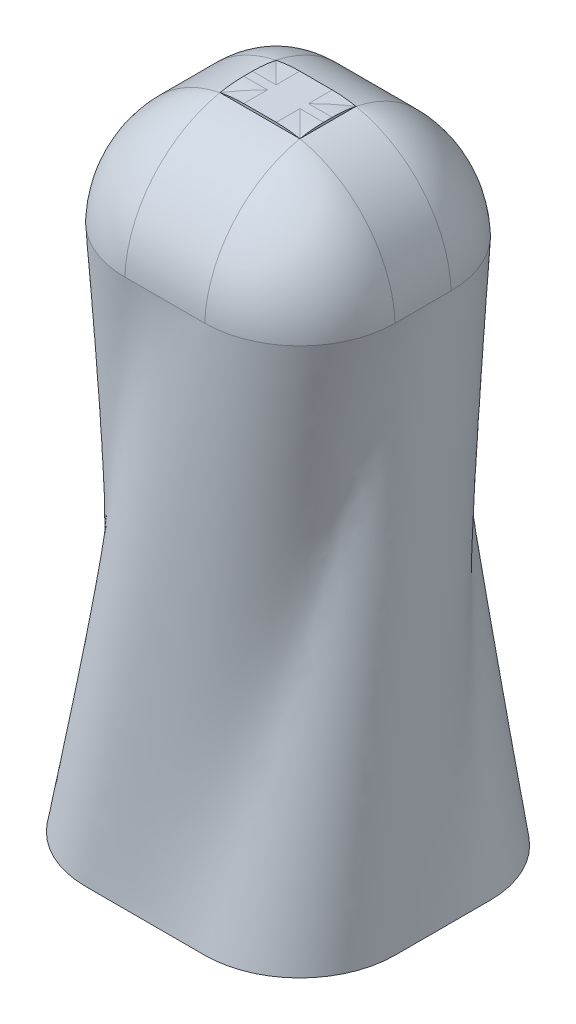
ISO-10303-21;
HEADER;
FILE_DESCRIPTION(('STEP AP214'),'2;1');
FILE_NAME('part.step','',(''),(''),'','','');
FILE_SCHEMA(('AUTOMOTIVE_DESIGN { 1 0 10303 214 1 1 1 1 }'));
ENDSEC;
DATA;
#1=APPLICATION_CONTEXT('core data for automotive mechanical design processes');
#2=APPLICATION_PROTOCOL_DEFINITION('international standard','automotive_design',2000,#1);
#3=PRODUCT_CONTEXT('',#1,'mechanical');
#4=PRODUCT('Part','Part','',(#3));
#5=PRODUCT_RELATED_PRODUCT_CATEGORY('part','',(#4));
#6=PRODUCT_DEFINITION_FORMATION('','',#4);
#7=PRODUCT_DEFINITION_CONTEXT('part definition',#1,'design');
#8=PRODUCT_DEFINITION('design','',#6,#7);
#9=PRODUCT_DEFINITION_SHAPE('','',#8);
#10=(LENGTH_UNIT() NAMED_UNIT(*) SI_UNIT(.MILLI.,.METRE.));
#11=(NAMED_UNIT(*) PLANE_ANGLE_UNIT() SI_UNIT($,.RADIAN.));
#12=(NAMED_UNIT(*) SI_UNIT($,.STERADIAN.) SOLID_ANGLE_UNIT());
#13=UNCERTAINTY_MEASURE_WITH_UNIT(LENGTH_MEASURE(1.E-05),#10,'distance_accuracy_value','');
#14=(GEOMETRIC_REPRESENTATION_CONTEXT(3) GLOBAL_UNCERTAINTY_ASSIGNED_CONTEXT((#13)) GLOBAL_UNIT_ASSIGNED_CONTEXT((#10,
#11,#12)) REPRESENTATION_CONTEXT('',''));
#15=CARTESIAN_POINT('',(0.,0.,0.));
#16=DIRECTION('',(0.,0.,1.));
#17=DIRECTION('',(1.,0.,0.));
#18=AXIS2_PLACEMENT_3D('',#15,#16,#17);
#19=CARTESIAN_POINT('',(1.67833,22.,0.181757005145817));
#20=DIRECTION('',(-1.,0.,0.));
#21=DIRECTION('',(0.,0.,1.));
#22=AXIS2_PLACEMENT_3D('',#19,#20,#21);
#23=CYLINDRICAL_SURFACE('',#22,5.);
#24=DIRECTION('',(-1.,0.,0.));
#25=VECTOR('',#24,1.);
#26=CARTESIAN_POINT('',(1.67833,26.8996777716425,1.17833));
#27=LINE('',#26,#25);
#28=CARTESIAN_POINT('',(-1.67833,26.8996777716425,1.17833));
#29=VERTEX_POINT('',#28);
#30=CARTESIAN_POINT('',(1.67833,26.8996777716425,1.17833));
#31=VERTEX_POINT('',#30);
#32=EDGE_CURVE('E631',#29,#31,#27,.F.);
#33=ORIENTED_EDGE('',*,*,#32,.F.);
#34=CARTESIAN_POINT('',(-1.67833,22.,0.181757005145817));
#35=DIRECTION('',(1.,0.,0.));
#36=DIRECTION('',(0.,0.,-1.));
#37=AXIS2_PLACEMENT_3D('',#34,#35,#36);
#38=CIRCLE('',#37,5.);
#39=CARTESIAN_POINT('',(-1.67833117397965,22.1850583025494,5.17833117397965));
#40=VERTEX_POINT('',#39);
#41=EDGE_CURVE('E355',#29,#40,#38,.T.);
#42=ORIENTED_EDGE('',*,*,#41,.T.);
#43=DIRECTION('',(1.,0.,0.));
#44=VECTOR('',#43,1.);
#45=CARTESIAN_POINT('',(-1.67833117397962,22.1850583025494,5.17833117397965));
#46=LINE('',#45,#44);
#47=CARTESIAN_POINT('',(1.67833117397963,22.1850583025494,5.17833117397983));
#48=VERTEX_POINT('',#47);
#49=EDGE_CURVE('E347',#40,#48,#46,.T.);
#50=ORIENTED_EDGE('',*,*,#49,.T.);
#51=CARTESIAN_POINT('',(1.67833,22.,0.181757005145817));
#52=DIRECTION('',(1.,0.,0.));
#53=DIRECTION('',(0.,0.,-1.));
#54=AXIS2_PLACEMENT_3D('',#51,#52,#53);
#55=CIRCLE('',#54,5.);
#56=EDGE_CURVE('E255',#31,#48,#55,.T.);
#57=ORIENTED_EDGE('',*,*,#56,.F.);
#58=EDGE_LOOP('',(#33,#42,#50,#57));
#59=FACE_BOUND('',#58,.T.);
#60=ADVANCED_FACE('F231',(#59),#23,.T.);
#61=CARTESIAN_POINT('',(2.5,0.,-2.));
#62=DIRECTION('',(0.,1.,0.));
#63=DIRECTION('',(0.,0.,1.));
#64=AXIS2_PLACEMENT_3D('',#61,#62,#63);
#65=PLANE('',#64);
#66=DIRECTION('',(1.,0.,0.));
#67=VECTOR('',#66,1.);
#68=CARTESIAN_POINT('',(-2.49999999999997,0.,-6.));
#69=LINE('',#68,#67);
#70=CARTESIAN_POINT('',(-2.49999999999997,0.,-6.));
#71=VERTEX_POINT('',#70);
#72=CARTESIAN_POINT('',(2.50000000006556,0.,-6.));
#73=VERTEX_POINT('',#72);
#74=EDGE_CURVE('E413',#71,#73,#69,.T.);
#75=ORIENTED_EDGE('',*,*,#74,.T.);
#76=CARTESIAN_POINT('',(2.5,0.,-2.));
#77=DIRECTION('',(0.,1.,0.));
#78=DIRECTION('',(0.,0.,1.));
#79=AXIS2_PLACEMENT_3D('',#76,#77,#78);
#80=CIRCLE('',#79,4.);
#81=CARTESIAN_POINT('',(6.5,0.,-2.00000000000749));
#82=VERTEX_POINT('',#81);
#83=EDGE_CURVE('E414',#82,#73,#80,.T.);
#84=ORIENTED_EDGE('',*,*,#83,.F.);
#85=DIRECTION('',(0.,0.,1.));
#86=VECTOR('',#85,1.);
#87=CARTESIAN_POINT('',(6.5,0.,-1.99999999999997));
#88=LINE('',#87,#86);
#89=CARTESIAN_POINT('',(6.5,0.,2.00000000001166));
#90=VERTEX_POINT('',#89);
#91=EDGE_CURVE('E411',#82,#90,#88,.T.);
#92=ORIENTED_EDGE('',*,*,#91,.T.);
#93=CARTESIAN_POINT('',(2.5,0.,2.));
#94=DIRECTION('',(0.,1.,0.));
#95=DIRECTION('',(0.,0.,1.));
#96=AXIS2_PLACEMENT_3D('',#93,#94,#95);
#97=CIRCLE('',#96,4.);
#98=CARTESIAN_POINT('',(2.49999999992394,0.,6.));
#99=VERTEX_POINT('',#98);
#100=EDGE_CURVE('E581',#99,#90,#97,.T.);
#101=ORIENTED_EDGE('',*,*,#100,.F.);
#102=DIRECTION('',(1.,0.,0.));
#103=VECTOR('',#102,1.);
#104=CARTESIAN_POINT('',(-2.49999999999997,0.,6.));
#105=LINE('',#104,#103);
#106=CARTESIAN_POINT('',(-2.50000000005308,0.,6.));
#107=VERTEX_POINT('',#106);
#108=EDGE_CURVE('E574',#107,#99,#105,.T.);
#109=ORIENTED_EDGE('',*,*,#108,.F.);
#110=CARTESIAN_POINT('',(-2.5,0.,2.));
#111=DIRECTION('',(0.,1.,0.));
#112=DIRECTION('',(0.,0.,1.));
#113=AXIS2_PLACEMENT_3D('',#110,#111,#112);
#114=CIRCLE('',#113,4.);
#115=CARTESIAN_POINT('',(-6.5,0.,2.00000000000564));
#116=VERTEX_POINT('',#115);
#117=EDGE_CURVE('E566',#116,#107,#114,.T.);
#118=ORIENTED_EDGE('',*,*,#117,.F.);
#119=DIRECTION('',(0.,0.,1.));
#120=VECTOR('',#119,1.);
#121=CARTESIAN_POINT('',(-6.5,0.,-1.99999999999997));
#122=LINE('',#121,#120);
#123=CARTESIAN_POINT('',(-6.5,0.,-1.99999999999997));
#124=VERTEX_POINT('',#123);
#125=EDGE_CURVE('E524',#124,#116,#122,.T.);
#126=ORIENTED_EDGE('',*,*,#125,.F.);
#127=CARTESIAN_POINT('',(-2.5,0.,-2.));
#128=DIRECTION('',(0.,1.,0.));
#129=DIRECTION('',(0.,0.,1.));
#130=AXIS2_PLACEMENT_3D('',#127,#128,#129);
#131=CIRCLE('',#130,4.);
#132=EDGE_CURVE('E564',#71,#124,#131,.T.);
#133=ORIENTED_EDGE('',*,*,#132,.F.);
#134=EDGE_LOOP('',(#75,#84,#92,#101,#109,#118,#126,#133));
#135=FACE_BOUND('',#134,.T.);
#136=ADVANCED_FACE('F232',(#135),#65,.F.);
#137=CARTESIAN_POINT('',(-5.67833117397965,22.1850583025494,-1.17833117340828));
#138=CARTESIAN_POINT('',(-2.49999999925383,0.,-6.));
#139=CARTESIAN_POINT('',(-5.67833117397965,22.1850583025494,-1.38639907238718));
#140=CARTESIAN_POINT('',(-2.22827429797479,0.,-6.));
#141=CARTESIAN_POINT('',(-5.64605302641538,22.1850583025494,-1.82607726432398));
#142=CARTESIAN_POINT('',(-1.74582637091288,0.,-6.));
#143=CARTESIAN_POINT('',(-5.46472874581911,22.1850583025493,-2.54440672483463));
#144=CARTESIAN_POINT('',(-1.12925114278918,0.,-6.));
#145=CARTESIAN_POINT('',(-5.11334826804942,22.1850583025494,-3.28660071372098));
#146=CARTESIAN_POINT('',(-0.543858808638478,0.,-6.));
#147=CARTESIAN_POINT('',(-4.57498057010733,22.1850583025493,-3.98513433925619));
#148=CARTESIAN_POINT('',(0.0245283083284582,0.,-5.99999999999999));
#149=CARTESIAN_POINT('',(-3.88305746142206,22.1850583025494,-4.55457915765431));
#150=CARTESIAN_POINT('',(0.590087884900871,0.,-6.));
#151=CARTESIAN_POINT('',(-3.11896752059369,22.1850583025494,-4.93983067621303));
#152=CARTESIAN_POINT('',(1.16893746069696,0.,-6.));
#153=CARTESIAN_POINT('',(-2.36377653377045,22.1850583025494,-5.14216911123749));
#154=CARTESIAN_POINT('',(1.77719457533491,0.,-6.));
#155=CARTESIAN_POINT('',(-1.89839247189438,22.1850583025494,-5.17833117397965));
#156=CARTESIAN_POINT('',(2.24242410167726,0.,-6.));
#157=CARTESIAN_POINT('',(-1.49673215436211,22.1850583025494,-5.17833117397965));
#158=CARTESIAN_POINT('',(2.71255682142672,0.,-6.));
#159=CARTESIAN_POINT('',(-1.17682647667778,22.1850583025494,-5.17833117397965));
#160=CARTESIAN_POINT('',(3.16455674210844,0.,-5.96637716465597));
#161=CARTESIAN_POINT('',(-0.77215939830002,22.1850583025494,-5.17833117397966));
#162=CARTESIAN_POINT('',(3.91134863609438,0.,-5.77232919441949));
#163=CARTESIAN_POINT('',(-0.387998111567679,22.1850583025494,-5.17833117397965));
#164=CARTESIAN_POINT('',(4.68364001340019,0.,-5.39115288388914));
#165=CARTESIAN_POINT('',(-0.0132035328769566,22.1850583025494,-5.17833117397965));
#166=CARTESIAN_POINT('',(5.3934370114742,0.,-4.81255322947438));
#167=CARTESIAN_POINT('',(0.363363421375944,22.1850583025494,-5.17833117397965));
#168=CARTESIAN_POINT('',(5.94272822724975,0.,-4.09763476093672));
#169=CARTESIAN_POINT('',(0.750993066196444,22.1850583025494,-5.17833117397966));
#170=CARTESIAN_POINT('',(6.29323787464468,0.,-3.34692858457538));
#171=CARTESIAN_POINT('',(1.15897571658996,22.1850583025494,-5.17833117397966));
#172=CARTESIAN_POINT('',(6.46946619389889,0.,-2.63305519137384));
#173=CARTESIAN_POINT('',(1.48834663748146,22.1850583025494,-5.17833117397965));
#174=CARTESIAN_POINT('',(6.5,0.,-2.20266359505753));
#175=CARTESIAN_POINT('',(1.89000695506829,22.1850583025494,-5.17833117397965));
#176=CARTESIAN_POINT('',(6.5,0.,-1.77419754191036));
#177=CARTESIAN_POINT('',(2.34071906616488,22.1850583025494,-5.14501076301079));
#178=CARTESIAN_POINT('',(6.5,0.,-1.38596517089738));
#179=CARTESIAN_POINT('',(3.08815321364674,22.1850583025494,-4.95137792861932));
#180=CARTESIAN_POINT('',(6.5,0.,-0.910671275394021));
#181=CARTESIAN_POINT('',(3.8640001631108,22.1850583025494,-4.56865674124155));
#182=CARTESIAN_POINT('',(6.5,0.,-0.459369066424194));
#183=CARTESIAN_POINT('',(4.57753841418017,22.1850583025493,-3.98551910446833));
#184=CARTESIAN_POINT('',(6.5,0.,-0.0185571836906811));
#185=CARTESIAN_POINT('',(5.12696606540073,22.1850583025494,-3.26639447523873));
#186=CARTESIAN_POINT('',(6.5,0.,0.425265733103734));
#187=CARTESIAN_POINT('',(5.47477151412648,22.1850583025493,-2.51559799611674));
#188=CARTESIAN_POINT('',(6.5,0.,0.881470931298837));
#189=CARTESIAN_POINT('',(5.64842530677857,22.1850583025494,-1.80550691962868));
#190=CARTESIAN_POINT('',(6.5,0.,1.35942965823441));
#191=CARTESIAN_POINT('',(5.67833117397965,22.1850583025494,-1.37897954430613));
#192=CARTESIAN_POINT('',(6.5,0.,1.76118741100149));
#193=CARTESIAN_POINT('',(5.67833117397965,22.1850583025494,-1.01898589331421));
#194=CARTESIAN_POINT('',(6.5,0.,2.18965346423331));
#195=CARTESIAN_POINT('',(5.67833117397965,22.1850583025494,-0.770918655719106));
#196=CARTESIAN_POINT('',(6.4734798999679,0.,2.59600747084708));
#197=CARTESIAN_POINT('',(5.67833117397965,22.1850583025494,-0.507021144780909));
#198=CARTESIAN_POINT('',(6.31166867197713,0.,3.29161642438336));
#199=CARTESIAN_POINT('',(5.67833117397965,22.1850583025494,-0.247660353544511));
#200=CARTESIAN_POINT('',(5.97033760716852,0.,4.05569991305112));
#201=CARTESIAN_POINT('',(5.67833117397966,22.1850583025494,0.00828857020073533));
#202=CARTESIAN_POINT('',(5.39987374391574,0.,4.812401888151));
#203=CARTESIAN_POINT('',(5.67833117397965,22.1850583025494,0.261950478665477));
#204=CARTESIAN_POINT('',(4.64607088543903,0.,5.41835509386949));
#205=CARTESIAN_POINT('',(5.67833117397965,22.1850583025494,0.518841302299624));
#206=CARTESIAN_POINT('',(3.85412415219265,0.,5.79267965921804));
#207=CARTESIAN_POINT('',(5.67833117397965,22.1850583025494,0.784476971553087));
#208=CARTESIAN_POINT('',(3.12457136421407,0.,5.97095443491581));
#209=CARTESIAN_POINT('',(5.67833117397965,22.1850583025494,1.02640542144354));
#210=CARTESIAN_POINT('',(2.69840701781632,0.,6.));
#211=CARTESIAN_POINT('',(5.67833117397965,22.1850583025494,1.38639907238718));
#212=CARTESIAN_POINT('',(2.22827429797479,0.,6.));
#213=CARTESIAN_POINT('',(5.64605302641538,22.1850583025493,1.82607726432398));
#214=CARTESIAN_POINT('',(1.74582637091287,0.,6.));
#215=CARTESIAN_POINT('',(5.46472874581911,22.1850583025494,2.54440672483463));
#216=CARTESIAN_POINT('',(1.12925114278917,0.,6.));
#217=CARTESIAN_POINT('',(5.11334826804942,22.1850583025494,3.28660071372098));
#218=CARTESIAN_POINT('',(0.543858808638466,0.,6.));
#219=CARTESIAN_POINT('',(4.57498057010733,22.1850583025494,3.98513433925618));
#220=CARTESIAN_POINT('',(-0.024528308328474,0.,5.99999999999999));
#221=CARTESIAN_POINT('',(3.88305746142206,22.1850583025494,4.55457915765432));
#222=CARTESIAN_POINT('',(-0.590087884900891,0.,6.));
#223=CARTESIAN_POINT('',(3.1189675205937,22.1850583025494,4.93983067621302));
#224=CARTESIAN_POINT('',(-1.16893746069698,0.,6.));
#225=CARTESIAN_POINT('',(2.36377653377045,22.1850583025494,5.14216911123749));
#226=CARTESIAN_POINT('',(-1.77719457533494,0.,6.));
#227=CARTESIAN_POINT('',(1.89839247189438,22.1850583025494,5.17833117397965));
#228=CARTESIAN_POINT('',(-2.24242410167729,0.,6.));
#229=CARTESIAN_POINT('',(1.49673215436211,22.1850583025494,5.17833117397965));
#230=CARTESIAN_POINT('',(-2.71255682142675,0.,6.));
#231=CARTESIAN_POINT('',(1.17682647667777,22.1850583025494,5.17833117397965));
#232=CARTESIAN_POINT('',(-3.16455674210847,0.,5.96637716465598));
#233=CARTESIAN_POINT('',(0.772159398300013,22.1850583025494,5.17833117397965));
#234=CARTESIAN_POINT('',(-3.9113486360944,0.,5.77232919441947));
#235=CARTESIAN_POINT('',(0.387998111567668,22.1850583025494,5.17833117397965));
#236=CARTESIAN_POINT('',(-4.68364001340021,0.,5.39115288388914));
#237=CARTESIAN_POINT('',(0.013203532876941,22.1850583025494,5.17833117397965));
#238=CARTESIAN_POINT('',(-5.39343701147419,0.,4.81255322947436));
#239=CARTESIAN_POINT('',(-0.363363421375964,22.1850583025494,5.17833117397965));
#240=CARTESIAN_POINT('',(-5.94272822724978,0.,4.09763476093673));
#241=CARTESIAN_POINT('',(-0.750993066196465,22.1850583025494,5.17833117397965));
#242=CARTESIAN_POINT('',(-6.29323787464466,0.,3.34692858457536));
#243=CARTESIAN_POINT('',(-1.15897571658998,22.1850583025494,5.17833117397965));
#244=CARTESIAN_POINT('',(-6.46946619389891,0.,2.63305519137385));
#245=CARTESIAN_POINT('',(-1.48834663748149,22.1850583025494,5.17833117397965));
#246=CARTESIAN_POINT('',(-6.5,0.,2.20266359505753));
#247=CARTESIAN_POINT('',(-1.89000695506832,22.1850583025494,5.17833117397965));
#248=CARTESIAN_POINT('',(-6.5,0.,1.77419754191036));
#249=CARTESIAN_POINT('',(-2.34071906616491,22.1850583025494,5.14501076301079));
#250=CARTESIAN_POINT('',(-6.5,0.,1.38596517089738));
#251=CARTESIAN_POINT('',(-3.08815321364677,22.1850583025493,4.95137792861931));
#252=CARTESIAN_POINT('',(-6.5,0.,0.910671275394022));
#253=CARTESIAN_POINT('',(-3.86400016311081,22.1850583025494,4.56865674124155));
#254=CARTESIAN_POINT('',(-6.5,0.,0.459369066424194));
#255=CARTESIAN_POINT('',(-4.57753841418019,22.1850583025493,3.98551910446831));
#256=CARTESIAN_POINT('',(-6.5,0.,0.0185571836906808));
#257=CARTESIAN_POINT('',(-5.12696606540073,22.1850583025494,3.26639447523872));
#258=CARTESIAN_POINT('',(-6.5,0.,-0.425265733103734));
#259=CARTESIAN_POINT('',(-5.47477151412648,22.1850583025493,2.51559799611674));
#260=CARTESIAN_POINT('',(-6.5,0.,-0.881470931298837));
#261=CARTESIAN_POINT('',(-5.64842530677857,22.1850583025494,1.80550691962868));
#262=CARTESIAN_POINT('',(-6.5,0.,-1.35942965823441));
#263=CARTESIAN_POINT('',(-5.67833117397965,22.1850583025494,1.37897954430613));
#264=CARTESIAN_POINT('',(-6.5,0.,-1.76118741100149));
#265=CARTESIAN_POINT('',(-5.67833117397965,22.1850583025494,1.01898589331421));
#266=CARTESIAN_POINT('',(-6.5,0.,-2.18965346423331));
#267=CARTESIAN_POINT('',(-5.67833117397965,22.1850583025494,0.770918655719107));
#268=CARTESIAN_POINT('',(-6.47347989996791,0.,-2.59600747084708));
#269=CARTESIAN_POINT('',(-5.67833117397965,22.1850583025494,0.507021144780909));
#270=CARTESIAN_POINT('',(-6.31166867197711,0.,-3.29161642438336));
#271=CARTESIAN_POINT('',(-5.67833117397965,22.1850583025494,0.247660353544511));
#272=CARTESIAN_POINT('',(-5.97033760716852,0.,-4.05569991305113));
#273=CARTESIAN_POINT('',(-5.67833117397965,22.1850583025494,-0.00828857020073513));
#274=CARTESIAN_POINT('',(-5.39987374391573,0.,-4.81240188815101));
#275=CARTESIAN_POINT('',(-5.67833117397965,22.1850583025494,-0.261950478665477));
#276=CARTESIAN_POINT('',(-4.64607088543904,0.,-5.41835509386949));
#277=CARTESIAN_POINT('',(-5.67833117397965,22.1850583025494,-0.518841302299624));
#278=CARTESIAN_POINT('',(-3.85412415219263,0.,-5.79267965921804));
#279=CARTESIAN_POINT('',(-5.67833117397965,22.1850583025494,-0.784476971553087));
#280=CARTESIAN_POINT('',(-3.12457136421408,0.,-5.97095443491581));
#281=CARTESIAN_POINT('',(-5.67833117397965,22.1850583025494,-1.02640542144354));
#282=CARTESIAN_POINT('',(-2.69840701781632,0.,-6.));
#283=CARTESIAN_POINT('',(-5.67833117397965,22.1850583025494,-1.17833117340828));
#284=CARTESIAN_POINT('',(-2.49999999925383,0.,-6.));
#285=B_SPLINE_SURFACE_WITH_KNOTS('',3,1,((#137,#138),(#139,#140),(#141,#142),(#143,#144),(#145,
#146),(#147,#148),(#149,#150),(#151,#152),(#153,#154),(#155,#156),(#157,#158),(#159,#160),(#161,
#162),(#163,#164),(#165,#166),(#167,#168),(#169,#170),(#171,#172),(#173,#174),(#175,#176),(#177,
#178),(#179,#180),(#181,#182),(#183,#184),(#185,#186),(#187,#188),(#189,#190),(#191,#192),(#193,
#194),(#195,#196),(#197,#198),(#199,#200),(#201,#202),(#203,#204),(#205,#206),(#207,#208),(#209,
#210),(#211,#212),(#213,#214),(#215,#216),(#217,#218),(#219,#220),(#221,#222),(#223,#224),(#225,
#226),(#227,#228),(#229,#230),(#231,#232),(#233,#234),(#235,#236),(#237,#238),(#239,#240),(#241,
#242),(#243,#244),(#245,#246),(#247,#248),(#249,#250),(#251,#252),(#253,#254),(#255,#256),(#257,
#258),(#259,#260),(#261,#262),(#263,#264),(#265,#266),(#267,#268),(#269,#270),(#271,#272),(#273,
#274),(#275,#276),(#277,#278),(#279,#280),(#281,#282),(#283,#284)),.UNSPECIFIED.,.T.,.F.,.F.,(4,
1,1,1,1,1,1,1,2,1,1,1,1,1,1,1,2,1,1,1,1,1,1,1,2,1,1,1,1,1,1,1,2,1,1,1,1,1,1,1,2,1,1,1,1,1,1,1,2,
1,1,1,1,1,1,1,2,1,1,1,1,1,1,1,4),(2,2),(0.,0.0179864774554994,0.0359729549109987,
0.0539594323664981,0.0719459098219974,0.0899323872774968,0.107918864732996,0.125905342188495,
0.143891819643995,0.158734623362728,0.173577427081462,0.188420230800195,0.203263034518929,
0.218105838237662,0.232948641956396,0.24779144567513,0.262634249393863,0.279171711595067,
0.29570917379627,0.312246635997474,0.328784098198678,0.345321560399881,0.361859022601085,
0.378396484802289,0.394933947003493,0.408067203628056,0.421200460252619,0.434333716877183,
0.447466973501746,0.46060023012631,0.473733486750873,0.486866743375437,0.5,0.517986477455499,
0.535972954910999,0.553959432366498,0.571945909821997,0.589932387277497,0.607918864732996,
0.625905342188496,0.643891819643995,0.658734623362729,0.673577427081462,0.688420230800196,
0.703263034518929,0.718105838237663,0.732948641956396,0.74779144567513,0.762634249393863,
0.779171711595067,0.795709173796271,0.812246635997474,0.828784098198678,0.845321560399882,
0.861859022601085,0.878396484802289,0.894933947003493,0.908067203628056,0.92120046025262,
0.934333716877183,0.947466973501746,0.96060023012631,0.973733486750873,0.986866743375437,1.),
(0.,1.),.UNSPECIFIED.);
#286=DIRECTION('',(1.,0.,0.));
#287=VECTOR('',#286,1.);
#288=CARTESIAN_POINT('',(-1.67833117397962,22.1850583025494,-5.17833117397965));
#289=LINE('',#288,#287);
#290=CARTESIAN_POINT('',(-1.67833234795925,22.1850583025494,-5.17833117397965));
#291=VERTEX_POINT('',#290);
#292=CARTESIAN_POINT('',(1.67833,22.1850583025494,-5.17833117397965));
#293=VERTEX_POINT('',#292);
#294=EDGE_CURVE('E545',#291,#293,#289,.T.);
#295=CARTESIAN_POINT('',(1.67833117397965,22.1850583025494,-1.17833117397965));
#296=DIRECTION('',(0.,1.,0.));
#297=DIRECTION('',(0.,0.,1.));
#298=AXIS2_PLACEMENT_3D('',#295,#296,#297);
#299=CIRCLE('',#298,4.);
#300=CARTESIAN_POINT('',(5.67833117397965,22.1850583025494,-1.17833));
#301=VERTEX_POINT('',#300);
#302=EDGE_CURVE('E543',#301,#293,#299,.T.);
#303=DIRECTION('',(0.,0.,1.));
#304=VECTOR('',#303,1.);
#305=CARTESIAN_POINT('',(5.67833117397965,22.1850583025494,-1.17833117397962));
#306=LINE('',#305,#304);
#307=CARTESIAN_POINT('',(5.67833117397965,22.1850583025494,1.17833));
#308=VERTEX_POINT('',#307);
#309=EDGE_CURVE('E238',#301,#308,#306,.T.);
#310=CARTESIAN_POINT('',(1.67833117397965,22.1850583025494,1.17833117397965));
#311=DIRECTION('',(0.,1.,0.));
#312=DIRECTION('',(0.,0.,1.));
#313=AXIS2_PLACEMENT_3D('',#310,#311,#312);
#314=CIRCLE('',#313,4.);
#315=EDGE_CURVE('E356',#48,#308,#314,.T.);
#316=CARTESIAN_POINT('',(-1.67833117397965,22.1850583025494,1.17833117397965));
#317=DIRECTION('',(0.,1.,0.));
#318=DIRECTION('',(0.,0.,1.));
#319=AXIS2_PLACEMENT_3D('',#316,#317,#318);
#320=CIRCLE('',#319,4.);
#321=CARTESIAN_POINT('',(-5.67833117397965,22.1850583025494,1.17833234795928));
#322=VERTEX_POINT('',#321);
#323=EDGE_CURVE('E357',#322,#40,#320,.T.);
#324=DIRECTION('',(0.,0.,1.));
#325=VECTOR('',#324,1.);
#326=CARTESIAN_POINT('',(-5.67833117397965,22.1850583025494,-1.17833117397962));
#327=LINE('',#326,#325);
#328=CARTESIAN_POINT('',(-5.67833117397965,22.1850583025494,-1.17833117397963));
#329=VERTEX_POINT('',#328);
#330=EDGE_CURVE('E538',#329,#322,#327,.T.);
#331=CARTESIAN_POINT('',(-1.67833117397965,22.1850583025494,-1.17833117397965));
#332=DIRECTION('',(0.,1.,0.));
#333=DIRECTION('',(0.,0.,1.));
#334=AXIS2_PLACEMENT_3D('',#331,#332,#333);
#335=CIRCLE('',#334,4.);
#336=EDGE_CURVE('E540',#291,#329,#335,.T.);
#337=ORIENTED_EDGE('',*,*,#294,.T.);
#338=ORIENTED_EDGE('',*,*,#302,.F.);
#339=ORIENTED_EDGE('',*,*,#309,.T.);
#340=ORIENTED_EDGE('',*,*,#315,.F.);
#341=ORIENTED_EDGE('',*,*,#49,.F.);
#342=ORIENTED_EDGE('',*,*,#323,.F.);
#343=ORIENTED_EDGE('',*,*,#330,.F.);
#344=ORIENTED_EDGE('',*,*,#336,.F.);
#345=EDGE_LOOP('',(#337,#338,#339,#340,#341,#342,#343,#344));
#346=FACE_BOUND('',#345,.T.);
#347=ORIENTED_EDGE('',*,*,#132,.T.);
#348=ORIENTED_EDGE('',*,*,#125,.T.);
#349=ORIENTED_EDGE('',*,*,#117,.T.);
#350=ORIENTED_EDGE('',*,*,#108,.T.);
#351=ORIENTED_EDGE('',*,*,#100,.T.);
#352=ORIENTED_EDGE('',*,*,#91,.F.);
#353=ORIENTED_EDGE('',*,*,#83,.T.);
#354=ORIENTED_EDGE('',*,*,#74,.F.);
#355=EDGE_LOOP('',(#347,#348,#349,#350,#351,#352,#353,#354));
#356=FACE_BOUND('',#355,.T.);
#357=ADVANCED_FACE('F362',(#346,#356),#285,.T.);
#358=CARTESIAN_POINT('',(1.67833,22.,-0.181757005145817));
#359=DIRECTION('',(-1.,0.,0.));
#360=DIRECTION('',(0.,0.,1.));
#361=AXIS2_PLACEMENT_3D('',#358,#359,#360);
#362=CYLINDRICAL_SURFACE('',#361,5.);
#363=CARTESIAN_POINT('',(-1.67833,22.,-0.181757005145817));
#364=DIRECTION('',(1.,0.,0.));
#365=DIRECTION('',(0.,0.,-1.));
#366=AXIS2_PLACEMENT_3D('',#363,#364,#365);
#367=CIRCLE('',#366,5.);
#368=CARTESIAN_POINT('',(-1.67833176096948,26.8996777716425,-1.17833));
#369=VERTEX_POINT('',#368);
#370=EDGE_CURVE('E384',#291,#369,#367,.T.);
#371=ORIENTED_EDGE('',*,*,#370,.T.);
#372=DIRECTION('',(-1.,0.,0.));
#373=VECTOR('',#372,1.);
#374=CARTESIAN_POINT('',(1.67833,26.8996777716425,-1.17833));
#375=LINE('',#374,#373);
#376=CARTESIAN_POINT('',(1.67833058699,26.8996777716425,-1.17833000000017));
#377=VERTEX_POINT('',#376);
#378=EDGE_CURVE('E634',#369,#377,#375,.F.);
#379=ORIENTED_EDGE('',*,*,#378,.T.);
#380=CARTESIAN_POINT('',(1.67833,22.,-0.181757005145817));
#381=DIRECTION('',(1.,0.,0.));
#382=DIRECTION('',(0.,0.,-1.));
#383=AXIS2_PLACEMENT_3D('',#380,#381,#382);
#384=CIRCLE('',#383,5.);
#385=EDGE_CURVE('E392',#293,#377,#384,.T.);
#386=ORIENTED_EDGE('',*,*,#385,.F.);
#387=ORIENTED_EDGE('',*,*,#294,.F.);
#388=EDGE_LOOP('',(#371,#379,#386,#387));
#389=FACE_BOUND('',#388,.T.);
#390=ADVANCED_FACE('F447',(#389),#362,.T.);
#391=CARTESIAN_POINT('',(-0.681757005145817,22.,-1.17833));
#392=DIRECTION('',(0.,0.,1.));
#393=DIRECTION('',(1.,0.,0.));
#394=AXIS2_PLACEMENT_3D('',#391,#392,#393);
#395=CYLINDRICAL_SURFACE('',#394,5.);
#396=DIRECTION('',(0.,0.,1.));
#397=VECTOR('',#396,1.);
#398=CARTESIAN_POINT('',(-1.67833,26.8996777716425,-1.17833));
#399=LINE('',#398,#397);
#400=EDGE_CURVE('E242',#369,#29,#399,.T.);
#401=ORIENTED_EDGE('',*,*,#400,.F.);
#402=CARTESIAN_POINT('',(-0.681757005145817,22.,-1.17833));
#403=DIRECTION('',(0.,0.,-1.));
#404=DIRECTION('',(-1.,0.,0.));
#405=AXIS2_PLACEMENT_3D('',#402,#403,#404);
#406=CIRCLE('',#405,5.);
#407=EDGE_CURVE('E895',#369,#329,#406,.F.);
#408=ORIENTED_EDGE('',*,*,#407,.T.);
#409=ORIENTED_EDGE('',*,*,#330,.T.);
#410=CARTESIAN_POINT('',(-0.681757005145817,22.,1.17833));
#411=DIRECTION('',(0.,0.,-1.));
#412=DIRECTION('',(-1.,0.,0.));
#413=AXIS2_PLACEMENT_3D('',#410,#411,#412);
#414=CIRCLE('',#413,5.);
#415=EDGE_CURVE('E638',#29,#322,#414,.F.);
#416=ORIENTED_EDGE('',*,*,#415,.F.);
#417=EDGE_LOOP('',(#401,#408,#409,#416));
#418=FACE_BOUND('',#417,.T.);
#419=ADVANCED_FACE('F639',(#418),#395,.T.);
#420=CARTESIAN_POINT('',(1.67833,27.,0.));
#421=DIRECTION('',(0.,1.,0.));
#422=DIRECTION('',(0.,0.,1.));
#423=AXIS2_PLACEMENT_3D('',#420,#421,#422);
#424=PLANE('',#423);
#425=DIRECTION('',(-1.,0.,0.));
#426=VECTOR('',#425,1.);
#427=CARTESIAN_POINT('',(1.67833,27.,0.181757005145783));
#428=LINE('',#427,#426);
#429=CARTESIAN_POINT('',(-0.681757005145782,27.,0.181757005145783));
#430=VERTEX_POINT('',#429);
#431=CARTESIAN_POINT('',(-1.67833,27.,0.181757005145783));
#432=VERTEX_POINT('',#431);
#433=EDGE_CURVE('E932',#430,#432,#428,.T.);
#434=ORIENTED_EDGE('',*,*,#433,.F.);
#435=DIRECTION('',(0.,0.,1.));
#436=VECTOR('',#435,1.);
#437=CARTESIAN_POINT('',(-0.681757005145782,27.,-1.17833));
#438=LINE('',#437,#436);
#439=CARTESIAN_POINT('',(-0.681757005145782,27.,1.17833));
#440=VERTEX_POINT('',#439);
#441=EDGE_CURVE('E660',#430,#440,#438,.T.);
#442=ORIENTED_EDGE('',*,*,#441,.T.);
#443=DIRECTION('',(1.,0.,0.));
#444=VECTOR('',#443,1.);
#445=CARTESIAN_POINT('',(0.,27.,1.17833));
#446=LINE('',#445,#444);
#447=CARTESIAN_POINT('',(0.681757005145782,27.,1.17833));
#448=VERTEX_POINT('',#447);
#449=EDGE_CURVE('E653',#440,#448,#446,.T.);
#450=ORIENTED_EDGE('',*,*,#449,.T.);
#451=DIRECTION('',(0.,0.,1.));
#452=VECTOR('',#451,1.);
#453=CARTESIAN_POINT('',(0.681757005145782,27.,-1.17833));
#454=LINE('',#453,#452);
#455=CARTESIAN_POINT('',(0.681757005145782,27.,0.181757005145783));
#456=VERTEX_POINT('',#455);
#457=EDGE_CURVE('E912',#456,#448,#454,.T.);
#458=ORIENTED_EDGE('',*,*,#457,.F.);
#459=CARTESIAN_POINT('',(1.67833,27.,0.181757005145783));
#460=VERTEX_POINT('',#459);
#461=EDGE_CURVE('E546',#460,#456,#428,.T.);
#462=ORIENTED_EDGE('',*,*,#461,.F.);
#463=DIRECTION('',(0.,0.,-1.));
#464=VECTOR('',#463,1.);
#465=CARTESIAN_POINT('',(1.67833,27.,0.));
#466=LINE('',#465,#464);
#467=CARTESIAN_POINT('',(1.67833,27.,-0.181757005145783));
#468=VERTEX_POINT('',#467);
#469=EDGE_CURVE('E380',#460,#468,#466,.T.);
#470=ORIENTED_EDGE('',*,*,#469,.T.);
#471=DIRECTION('',(-1.,0.,0.));
#472=VECTOR('',#471,1.);
#473=CARTESIAN_POINT('',(1.67833,27.,-0.181757005145783));
#474=LINE('',#473,#472);
#475=CARTESIAN_POINT('',(0.681757005145782,27.,-0.181757005145817));
#476=VERTEX_POINT('',#475);
#477=EDGE_CURVE('E928',#468,#476,#474,.T.);
#478=ORIENTED_EDGE('',*,*,#477,.T.);
#479=CARTESIAN_POINT('',(0.681757005145782,27.,-1.17833));
#480=VERTEX_POINT('',#479);
#481=EDGE_CURVE('E917',#480,#476,#454,.T.);
#482=ORIENTED_EDGE('',*,*,#481,.F.);
#483=DIRECTION('',(1.,0.,0.));
#484=VECTOR('',#483,1.);
#485=CARTESIAN_POINT('',(0.,27.,-1.17833));
#486=LINE('',#485,#484);
#487=CARTESIAN_POINT('',(-0.681757005145782,27.,-1.17833));
#488=VERTEX_POINT('',#487);
#489=EDGE_CURVE('E909',#488,#480,#486,.T.);
#490=ORIENTED_EDGE('',*,*,#489,.F.);
#491=CARTESIAN_POINT('',(-0.681757005145782,27.,-0.181757005145817));
#492=VERTEX_POINT('',#491);
#493=EDGE_CURVE('E636',#488,#492,#438,.T.);
#494=ORIENTED_EDGE('',*,*,#493,.T.);
#495=CARTESIAN_POINT('',(-1.67833,27.,-0.181757005145783));
#496=VERTEX_POINT('',#495);
#497=EDGE_CURVE('E400',#492,#496,#474,.T.);
#498=ORIENTED_EDGE('',*,*,#497,.T.);
#499=DIRECTION('',(0.,0.,-1.));
#500=VECTOR('',#499,1.);
#501=CARTESIAN_POINT('',(-1.67833,27.,0.));
#502=LINE('',#501,#500);
#503=EDGE_CURVE('E664',#432,#496,#502,.T.);
#504=ORIENTED_EDGE('',*,*,#503,.F.);
#505=EDGE_LOOP('',(#434,#442,#450,#458,#462,#470,#478,#482,#490,#494,#498,#504));
#506=FACE_BOUND('',#505,.T.);
#507=ADVANCED_FACE('F450',(#506),#424,.T.);
#508=CARTESIAN_POINT('',(-1.67833,0.,0.));
#509=DIRECTION('',(1.,0.,0.));
#510=DIRECTION('',(0.,0.,-1.));
#511=AXIS2_PLACEMENT_3D('',#508,#509,#510);
#512=PLANE('',#511);
#513=EDGE_CURVE('E622',#369,#496,#367,.T.);
#514=ORIENTED_EDGE('',*,*,#513,.F.);
#515=ORIENTED_EDGE('',*,*,#400,.T.);
#516=EDGE_CURVE('E256',#432,#29,#38,.T.);
#517=ORIENTED_EDGE('',*,*,#516,.F.);
#518=ORIENTED_EDGE('',*,*,#503,.T.);
#519=EDGE_LOOP('',(#514,#515,#517,#518));
#520=FACE_BOUND('',#519,.T.);
#521=ADVANCED_FACE('F623',(#520),#512,.F.);
#522=ORIENTED_EDGE('',*,*,#497,.F.);
#523=CARTESIAN_POINT('',(-0.681757005145817,22.,-0.181757005145817));
#524=DIRECTION('',(-0.707106781186547,0.,0.707106781186547));
#525=DIRECTION('',(-0.707106781186547,0.,-0.707106781186547));
#526=AXIS2_PLACEMENT_3D('',#523,#524,#525);
#527=ELLIPSE('',#526,7.07106781186547,5.);
#528=EDGE_CURVE('E659',#492,#369,#527,.T.);
#529=ORIENTED_EDGE('',*,*,#528,.T.);
#530=ORIENTED_EDGE('',*,*,#513,.T.);
#531=EDGE_LOOP('',(#522,#529,#530));
#532=FACE_BOUND('',#531,.T.);
#533=ADVANCED_FACE('F693',(#532),#362,.T.);
#534=ORIENTED_EDGE('',*,*,#516,.T.);
#535=CARTESIAN_POINT('',(-0.681757005145817,22.,0.181757005145817));
#536=DIRECTION('',(-0.707106781186547,0.,-0.707106781186547));
#537=DIRECTION('',(-0.707106781186547,0.,0.707106781186547));
#538=AXIS2_PLACEMENT_3D('',#535,#536,#537);
#539=ELLIPSE('',#538,7.07106781186547,5.);
#540=EDGE_CURVE('E651',#29,#430,#539,.T.);
#541=ORIENTED_EDGE('',*,*,#540,.T.);
#542=ORIENTED_EDGE('',*,*,#433,.T.);
#543=EDGE_LOOP('',(#534,#541,#542));
#544=FACE_BOUND('',#543,.T.);
#545=ADVANCED_FACE('F694',(#544),#23,.T.);
#546=CARTESIAN_POINT('',(1.67833,0.,0.));
#547=DIRECTION('',(1.,0.,0.));
#548=DIRECTION('',(0.,0.,-1.));
#549=AXIS2_PLACEMENT_3D('',#546,#547,#548);
#550=PLANE('',#549);
#551=DIRECTION('',(0.,0.,1.));
#552=VECTOR('',#551,1.);
#553=CARTESIAN_POINT('',(1.67833,26.8996777716425,-1.17833));
#554=LINE('',#553,#552);
#555=EDGE_CURVE('E12',#377,#31,#554,.T.);
#556=ORIENTED_EDGE('',*,*,#555,.F.);
#557=EDGE_CURVE('E379',#377,#468,#384,.T.);
#558=ORIENTED_EDGE('',*,*,#557,.T.);
#559=ORIENTED_EDGE('',*,*,#469,.F.);
#560=EDGE_CURVE('E376',#460,#31,#55,.T.);
#561=ORIENTED_EDGE('',*,*,#560,.T.);
#562=EDGE_LOOP('',(#556,#558,#559,#561));
#563=FACE_BOUND('',#562,.T.);
#564=ADVANCED_FACE('F698',(#563),#550,.T.);
#565=ORIENTED_EDGE('',*,*,#557,.F.);
#566=CARTESIAN_POINT('',(0.681757005145817,22.,-0.181757005145817));
#567=DIRECTION('',(-0.707106781186547,0.,-0.707106781186547));
#568=DIRECTION('',(-0.707106781186547,0.,0.707106781186547));
#569=AXIS2_PLACEMENT_3D('',#566,#567,#568);
#570=ELLIPSE('',#569,7.07106781186547,5.);
#571=EDGE_CURVE('E657',#377,#476,#570,.F.);
#572=ORIENTED_EDGE('',*,*,#571,.T.);
#573=ORIENTED_EDGE('',*,*,#477,.F.);
#574=EDGE_LOOP('',(#565,#572,#573));
#575=FACE_BOUND('',#574,.T.);
#576=ADVANCED_FACE('F695',(#575),#362,.T.);
#577=ORIENTED_EDGE('',*,*,#461,.T.);
#578=CARTESIAN_POINT('',(0.681757005145817,22.,0.181757005145817));
#579=DIRECTION('',(-0.707106781186547,0.,0.707106781186547));
#580=DIRECTION('',(-0.707106781186547,0.,-0.707106781186547));
#581=AXIS2_PLACEMENT_3D('',#578,#579,#580);
#582=ELLIPSE('',#581,7.07106781186547,5.);
#583=EDGE_CURVE('E667',#456,#31,#582,.F.);
#584=ORIENTED_EDGE('',*,*,#583,.T.);
#585=ORIENTED_EDGE('',*,*,#560,.F.);
#586=EDGE_LOOP('',(#577,#584,#585));
#587=FACE_BOUND('',#586,.T.);
#588=ADVANCED_FACE('F697',(#587),#23,.T.);
#589=CARTESIAN_POINT('',(0.681757005145817,22.,-1.17833));
#590=DIRECTION('',(0.,0.,1.));
#591=DIRECTION('',(1.,0.,0.));
#592=AXIS2_PLACEMENT_3D('',#589,#590,#591);
#593=CYLINDRICAL_SURFACE('',#592,5.);
#594=CARTESIAN_POINT('',(0.681757005145817,22.,-1.17833));
#595=DIRECTION('',(0.,0.,-1.));
#596=DIRECTION('',(-1.,0.,0.));
#597=AXIS2_PLACEMENT_3D('',#594,#595,#596);
#598=CIRCLE('',#597,5.);
#599=EDGE_CURVE('E902',#301,#377,#598,.F.);
#600=ORIENTED_EDGE('',*,*,#599,.T.);
#601=ORIENTED_EDGE('',*,*,#555,.T.);
#602=CARTESIAN_POINT('',(0.681757005145817,22.,1.17833));
#603=DIRECTION('',(0.,0.,-1.));
#604=DIRECTION('',(-1.,0.,0.));
#605=AXIS2_PLACEMENT_3D('',#602,#603,#604);
#606=CIRCLE('',#605,5.);
#607=EDGE_CURVE('E374',#308,#31,#606,.F.);
#608=ORIENTED_EDGE('',*,*,#607,.F.);
#609=ORIENTED_EDGE('',*,*,#309,.F.);
#610=EDGE_LOOP('',(#600,#601,#608,#609));
#611=FACE_BOUND('',#610,.T.);
#612=ADVANCED_FACE('F718',(#611),#593,.T.);
#613=CARTESIAN_POINT('',(0.,0.,-1.17833));
#614=DIRECTION('',(0.,0.,-1.));
#615=DIRECTION('',(-1.,0.,0.));
#616=AXIS2_PLACEMENT_3D('',#613,#614,#615);
#617=PLANE('',#616);
#618=ORIENTED_EDGE('',*,*,#378,.F.);
#619=EDGE_CURVE('E899',#488,#369,#406,.F.);
#620=ORIENTED_EDGE('',*,*,#619,.F.);
#621=ORIENTED_EDGE('',*,*,#489,.T.);
#622=EDGE_CURVE('E906',#377,#480,#598,.F.);
#623=ORIENTED_EDGE('',*,*,#622,.F.);
#624=EDGE_LOOP('',(#618,#620,#621,#623));
#625=FACE_BOUND('',#624,.T.);
#626=ADVANCED_FACE('F782',(#625),#617,.T.);
#627=ORIENTED_EDGE('',*,*,#528,.F.);
#628=ORIENTED_EDGE('',*,*,#493,.F.);
#629=ORIENTED_EDGE('',*,*,#619,.T.);
#630=EDGE_LOOP('',(#627,#628,#629));
#631=FACE_BOUND('',#630,.T.);
#632=ADVANCED_FACE('F751',(#631),#395,.T.);
#633=ORIENTED_EDGE('',*,*,#571,.F.);
#634=ORIENTED_EDGE('',*,*,#622,.T.);
#635=ORIENTED_EDGE('',*,*,#481,.T.);
#636=EDGE_LOOP('',(#633,#634,#635));
#637=FACE_BOUND('',#636,.T.);
#638=ADVANCED_FACE('F746',(#637),#593,.T.);
#639=ORIENTED_EDGE('',*,*,#583,.F.);
#640=ORIENTED_EDGE('',*,*,#457,.T.);
#641=EDGE_CURVE('E915',#31,#448,#606,.F.);
#642=ORIENTED_EDGE('',*,*,#641,.F.);
#643=EDGE_LOOP('',(#639,#640,#642));
#644=FACE_BOUND('',#643,.T.);
#645=ADVANCED_FACE('F755',(#644),#593,.T.);
#646=ORIENTED_EDGE('',*,*,#540,.F.);
#647=EDGE_CURVE('E641',#440,#29,#414,.F.);
#648=ORIENTED_EDGE('',*,*,#647,.F.);
#649=ORIENTED_EDGE('',*,*,#441,.F.);
#650=EDGE_LOOP('',(#646,#648,#649));
#651=FACE_BOUND('',#650,.T.);
#652=ADVANCED_FACE('F656',(#651),#395,.T.);
#653=CARTESIAN_POINT('',(0.,0.,1.17833));
#654=DIRECTION('',(0.,0.,-1.));
#655=DIRECTION('',(-1.,0.,0.));
#656=AXIS2_PLACEMENT_3D('',#653,#654,#655);
#657=PLANE('',#656);
#658=ORIENTED_EDGE('',*,*,#647,.T.);
#659=ORIENTED_EDGE('',*,*,#32,.T.);
#660=ORIENTED_EDGE('',*,*,#641,.T.);
#661=ORIENTED_EDGE('',*,*,#449,.F.);
#662=EDGE_LOOP('',(#658,#659,#660,#661));
#663=FACE_BOUND('',#662,.T.);
#664=ADVANCED_FACE('F646',(#663),#657,.F.);
#665=CARTESIAN_POINT('',(1.67833117397965,22.,-2.17490534281418));
#666=DIRECTION('',(-1.,0.,0.));
#667=DIRECTION('',(0.,0.,1.));
#668=AXIS2_PLACEMENT_3D('',#665,#666,#667);
#669=CIRCLE('',#668,5.);
#670=TRIMMED_CURVE('',#669,(PARAMETER_VALUE(-1.37013765101731)),
(PARAMETER_VALUE(1.37013765101731)),.T.,.PARAMETER.);
#671=CARTESIAN_POINT('',(1.67833117397965,22.,-1.17833117397965));
#672=DIRECTION('',(0.,1.,0.));
#673=AXIS1_PLACEMENT('',#671,#672);
#674=SURFACE_OF_REVOLUTION('',#670,#673);
#675=ORIENTED_EDGE('',*,*,#302,.T.);
#676=ORIENTED_EDGE('',*,*,#385,.T.);
#677=ORIENTED_EDGE('',*,*,#599,.F.);
#678=EDGE_LOOP('',(#675,#676,#677));
#679=FACE_BOUND('',#678,.T.);
#680=ADVANCED_FACE('F761',(#679),#674,.T.);
#681=CARTESIAN_POINT('',(-1.67833117397965,22.,-2.17490534281418));
#682=DIRECTION('',(-1.,0.,0.));
#683=DIRECTION('',(0.,0.,1.));
#684=AXIS2_PLACEMENT_3D('',#681,#682,#683);
#685=CIRCLE('',#684,5.);
#686=TRIMMED_CURVE('',#685,(PARAMETER_VALUE(-1.37013765101731)),
(PARAMETER_VALUE(1.37013765101731)),.T.,.PARAMETER.);
#687=CARTESIAN_POINT('',(-1.67833117397965,22.,-1.17833117397965));
#688=DIRECTION('',(0.,1.,0.));
#689=AXIS1_PLACEMENT('',#687,#688);
#690=SURFACE_OF_REVOLUTION('',#686,#689);
#691=ORIENTED_EDGE('',*,*,#370,.F.);
#692=ORIENTED_EDGE('',*,*,#336,.T.);
#693=ORIENTED_EDGE('',*,*,#407,.F.);
#694=EDGE_LOOP('',(#691,#692,#693));
#695=FACE_BOUND('',#694,.T.);
#696=ADVANCED_FACE('F762',(#695),#690,.T.);
#697=CARTESIAN_POINT('',(-1.67833117397965,22.,0.181757005145126));
#698=DIRECTION('',(-1.,0.,0.));
#699=DIRECTION('',(0.,0.,1.));
#700=AXIS2_PLACEMENT_3D('',#697,#698,#699);
#701=CIRCLE('',#700,5.);
#702=TRIMMED_CURVE('',#701,(PARAMETER_VALUE(-1.37013765101731)),
(PARAMETER_VALUE(1.37013765101731)),.T.,.PARAMETER.);
#703=CARTESIAN_POINT('',(-1.67833117397965,22.,1.17833117397965));
#704=DIRECTION('',(0.,1.,0.));
#705=AXIS1_PLACEMENT('',#703,#704);
#706=SURFACE_OF_REVOLUTION('',#702,#705);
#707=ORIENTED_EDGE('',*,*,#415,.T.);
#708=ORIENTED_EDGE('',*,*,#323,.T.);
#709=ORIENTED_EDGE('',*,*,#41,.F.);
#710=EDGE_LOOP('',(#707,#708,#709));
#711=FACE_BOUND('',#710,.T.);
#712=ADVANCED_FACE('F665',(#711),#706,.T.);
#713=CARTESIAN_POINT('',(1.67833117397965,22.,0.181757005145127));
#714=DIRECTION('',(-1.,0.,0.));
#715=DIRECTION('',(0.,0.,1.));
#716=AXIS2_PLACEMENT_3D('',#713,#714,#715);
#717=CIRCLE('',#716,5.);
#718=TRIMMED_CURVE('',#717,(PARAMETER_VALUE(-1.37013765101731)),
(PARAMETER_VALUE(1.37013765101731)),.T.,.PARAMETER.);
#719=CARTESIAN_POINT('',(1.67833117397965,22.,1.17833117397965));
#720=DIRECTION('',(0.,1.,0.));
#721=AXIS1_PLACEMENT('',#719,#720);
#722=SURFACE_OF_REVOLUTION('',#718,#721);
#723=ORIENTED_EDGE('',*,*,#56,.T.);
#724=ORIENTED_EDGE('',*,*,#315,.T.);
#725=ORIENTED_EDGE('',*,*,#607,.T.);
#726=EDGE_LOOP('',(#723,#724,#725));
#727=FACE_BOUND('',#726,.T.);
#728=ADVANCED_FACE('F372',(#727),#722,.T.);
#729=CLOSED_SHELL('',(#60,#136,#357,#390,#419,#507,#521,#533,#545,#564,#576,#588,#612,#626,#632,
#638,#645,#652,#664,#680,#696,#712,#728));
#730=MANIFOLD_SOLID_BREP('B2',#729);
#731=ADVANCED_BREP_SHAPE_REPRESENTATION('',(#18,#730),#14);
#732=SHAPE_DEFINITION_REPRESENTATION(#9,#731);
ENDSEC;
END-ISO-10303-21;
